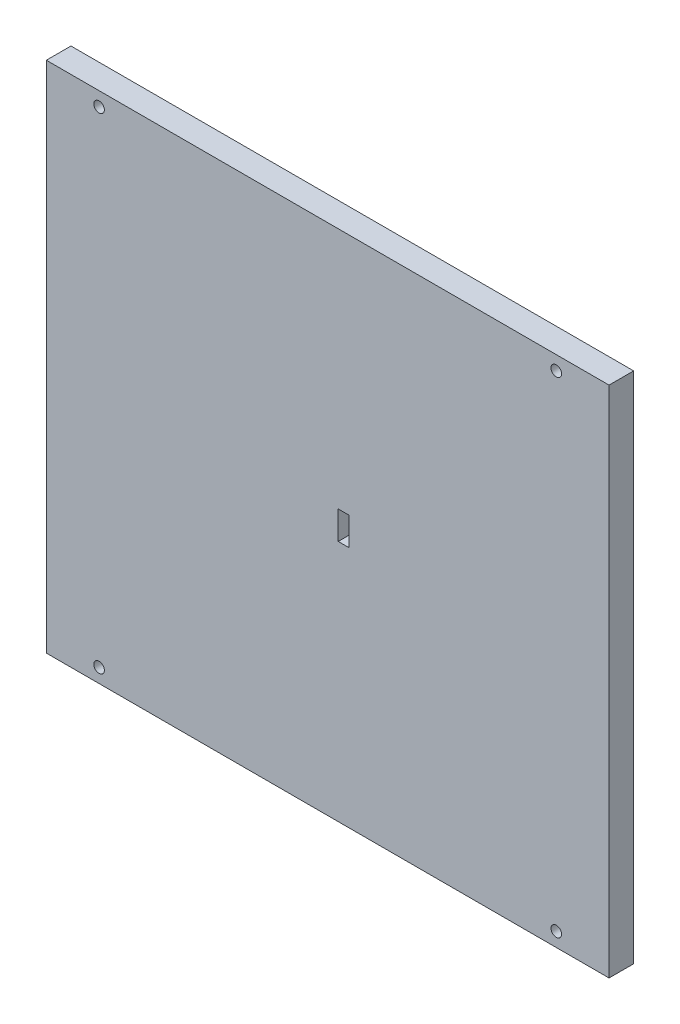
ISO-10303-21;
HEADER;
FILE_DESCRIPTION(('STEP AP214'),'2;1');
FILE_NAME('part.step','',(''),(''),'','','');
FILE_SCHEMA(('AUTOMOTIVE_DESIGN { 1 0 10303 214 1 1 1 1 }'));
ENDSEC;
DATA;
#1=APPLICATION_CONTEXT('core data for automotive mechanical design processes');
#2=APPLICATION_PROTOCOL_DEFINITION('international standard','automotive_design',2000,#1);
#3=PRODUCT_CONTEXT('',#1,'mechanical');
#4=PRODUCT('Part','Part','',(#3));
#5=PRODUCT_RELATED_PRODUCT_CATEGORY('part','',(#4));
#6=PRODUCT_DEFINITION_FORMATION('','',#4);
#7=PRODUCT_DEFINITION_CONTEXT('part definition',#1,'design');
#8=PRODUCT_DEFINITION('design','',#6,#7);
#9=PRODUCT_DEFINITION_SHAPE('','',#8);
#10=(LENGTH_UNIT() NAMED_UNIT(*) SI_UNIT(.MILLI.,.METRE.));
#11=(NAMED_UNIT(*) PLANE_ANGLE_UNIT() SI_UNIT($,.RADIAN.));
#12=(NAMED_UNIT(*) SI_UNIT($,.STERADIAN.) SOLID_ANGLE_UNIT());
#13=UNCERTAINTY_MEASURE_WITH_UNIT(LENGTH_MEASURE(1.E-05),#10,'distance_accuracy_value','');
#14=(GEOMETRIC_REPRESENTATION_CONTEXT(3) GLOBAL_UNCERTAINTY_ASSIGNED_CONTEXT((#13)) GLOBAL_UNIT_ASSIGNED_CONTEXT((#10,
#11,#12)) REPRESENTATION_CONTEXT('',''));
#15=CARTESIAN_POINT('',(0.,0.,0.));
#16=DIRECTION('',(0.,0.,1.));
#17=DIRECTION('',(1.,0.,0.));
#18=AXIS2_PLACEMENT_3D('',#15,#16,#17);
#19=CARTESIAN_POINT('',(0.,0.,0.));
#20=DIRECTION('',(0.,0.,1.));
#21=DIRECTION('',(1.,0.,0.));
#22=AXIS2_PLACEMENT_3D('',#19,#20,#21);
#23=PLANE('',#22);
#24=DIRECTION('',(-1.,0.,0.));
#25=VECTOR('',#24,1.);
#26=CARTESIAN_POINT('',(2.51612513721186,2.01,0.));
#27=LINE('',#26,#25);
#28=CARTESIAN_POINT('',(2.51612513721186,2.01,0.));
#29=VERTEX_POINT('',#28);
#30=CARTESIAN_POINT('',(-0.483874862788143,2.01,0.));
#31=VERTEX_POINT('',#30);
#32=EDGE_CURVE('E152',#29,#31,#27,.T.);
#33=ORIENTED_EDGE('',*,*,#32,.F.);
#34=DIRECTION('',(0.,-1.,0.));
#35=VECTOR('',#34,1.);
#36=CARTESIAN_POINT('',(2.51612513721186,0.0100000000000022,0.));
#37=LINE('',#36,#35);
#38=CARTESIAN_POINT('',(2.51612513721186,0.0100000000000022,0.));
#39=VERTEX_POINT('',#38);
#40=EDGE_CURVE('E162',#29,#39,#37,.T.);
#41=ORIENTED_EDGE('',*,*,#40,.T.);
#42=DIRECTION('',(-1.,0.,0.));
#43=VECTOR('',#42,1.);
#44=CARTESIAN_POINT('',(2.51612513721186,0.0100000000000022,0.));
#45=LINE('',#44,#43);
#46=CARTESIAN_POINT('',(-20.4838748627881,0.0100000000000022,0.));
#47=VERTEX_POINT('',#46);
#48=EDGE_CURVE('E175',#39,#47,#45,.T.);
#49=ORIENTED_EDGE('',*,*,#48,.T.);
#50=DIRECTION('',(0.,1.,0.));
#51=VECTOR('',#50,1.);
#52=CARTESIAN_POINT('',(-20.4838748627881,0.0100000000000022,0.));
#53=LINE('',#52,#51);
#54=CARTESIAN_POINT('',(-20.4838748627881,12.01,0.));
#55=VERTEX_POINT('',#54);
#56=EDGE_CURVE('E177',#47,#55,#53,.T.);
#57=ORIENTED_EDGE('',*,*,#56,.T.);
#58=DIRECTION('',(1.,0.,0.));
#59=VECTOR('',#58,1.);
#60=CARTESIAN_POINT('',(2.51612513721186,12.01,0.));
#61=LINE('',#60,#59);
#62=CARTESIAN_POINT('',(2.51612513721186,12.01,0.));
#63=VERTEX_POINT('',#62);
#64=EDGE_CURVE('E172',#55,#63,#61,.T.);
#65=ORIENTED_EDGE('',*,*,#64,.T.);
#66=CARTESIAN_POINT('',(2.51612513721186,10.01,0.));
#67=VERTEX_POINT('',#66);
#68=EDGE_CURVE('E171',#63,#67,#37,.T.);
#69=ORIENTED_EDGE('',*,*,#68,.T.);
#70=DIRECTION('',(1.,0.,0.));
#71=VECTOR('',#70,1.);
#72=CARTESIAN_POINT('',(2.51612513721186,10.01,0.));
#73=LINE('',#72,#71);
#74=CARTESIAN_POINT('',(-0.483874862788143,10.01,0.));
#75=VERTEX_POINT('',#74);
#76=EDGE_CURVE('E158',#75,#67,#73,.T.);
#77=ORIENTED_EDGE('',*,*,#76,.F.);
#78=DIRECTION('',(0.,1.,0.));
#79=VECTOR('',#78,1.);
#80=CARTESIAN_POINT('',(-0.483874862788143,2.01,0.));
#81=LINE('',#80,#79);
#82=EDGE_CURVE('E53',#31,#75,#81,.T.);
#83=ORIENTED_EDGE('',*,*,#82,.F.);
#84=EDGE_LOOP('',(#33,#41,#49,#57,#65,#69,#77,#83));
#85=FACE_BOUND('',#84,.T.);
#86=ADVANCED_FACE('F38',(#85),#23,.F.);
#87=DIRECTION('',(0.,-1.,0.));
#88=VECTOR('',#87,1.);
#89=CARTESIAN_POINT('',(8.51612513721186,-5.99,0.));
#90=LINE('',#89,#88);
#91=CARTESIAN_POINT('',(8.51612513721186,18.01,0.));
#92=VERTEX_POINT('',#91);
#93=CARTESIAN_POINT('',(8.51612513721186,-5.99,0.));
#94=VERTEX_POINT('',#93);
#95=EDGE_CURVE('E193',#92,#94,#90,.T.);
#96=ORIENTED_EDGE('',*,*,#95,.F.);
#97=DIRECTION('',(1.,0.,0.));
#98=VECTOR('',#97,1.);
#99=CARTESIAN_POINT('',(8.51612513721186,18.01,0.));
#100=LINE('',#99,#98);
#101=CARTESIAN_POINT('',(-26.4838748627881,18.01,0.));
#102=VERTEX_POINT('',#101);
#103=EDGE_CURVE('E198',#102,#92,#100,.T.);
#104=ORIENTED_EDGE('',*,*,#103,.F.);
#105=DIRECTION('',(0.,1.,0.));
#106=VECTOR('',#105,1.);
#107=CARTESIAN_POINT('',(-26.4838748627881,-5.99,0.));
#108=LINE('',#107,#106);
#109=CARTESIAN_POINT('',(-26.4838748627881,-5.99,0.));
#110=VERTEX_POINT('',#109);
#111=EDGE_CURVE('E210',#110,#102,#108,.T.);
#112=ORIENTED_EDGE('',*,*,#111,.F.);
#113=DIRECTION('',(-1.,0.,0.));
#114=VECTOR('',#113,1.);
#115=CARTESIAN_POINT('',(8.51612513721186,-5.99,0.));
#116=LINE('',#115,#114);
#117=EDGE_CURVE('E207',#94,#110,#116,.T.);
#118=ORIENTED_EDGE('',*,*,#117,.F.);
#119=EDGE_LOOP('',(#96,#104,#112,#118));
#120=FACE_BOUND('',#119,.T.);
#121=CARTESIAN_POINT('',(-3.48387486278814,6.01000000000001,0.));
#122=DIRECTION('',(0.,0.,-1.));
#123=DIRECTION('',(-1.,0.,0.));
#124=AXIS2_PLACEMENT_3D('',#121,#122,#123);
#125=CIRCLE('',#124,36.5);
#126=CARTESIAN_POINT('',(33.0161251372119,6.01000000000001,0.));
#127=VERTEX_POINT('',#126);
#128=EDGE_CURVE('E302',#127,#127,#125,.T.);
#129=ORIENTED_EDGE('',*,*,#128,.T.);
#130=EDGE_LOOP('',(#129));
#131=FACE_BOUND('',#130,.T.);
#132=ADVANCED_FACE('F356',(#120,#131),#23,.F.);
#133=CARTESIAN_POINT('',(0.,0.,-13.5));
#134=DIRECTION('',(0.,0.,1.));
#135=DIRECTION('',(1.,0.,0.));
#136=AXIS2_PLACEMENT_3D('',#133,#134,#135);
#137=PLANE('',#136);
#138=CARTESIAN_POINT('',(-22.7338748627881,6.01,-13.5));
#139=DIRECTION('',(0.,0.,-1.));
#140=DIRECTION('',(-1.,0.,0.));
#141=AXIS2_PLACEMENT_3D('',#138,#139,#140);
#142=CIRCLE('',#141,1.);
#143=CARTESIAN_POINT('',(-23.7338748627881,6.01,-13.5));
#144=VERTEX_POINT('',#143);
#145=EDGE_CURVE('E327',#144,#144,#142,.T.);
#146=ORIENTED_EDGE('',*,*,#145,.F.);
#147=EDGE_LOOP('',(#146));
#148=FACE_BOUND('',#147,.T.);
#149=CARTESIAN_POINT('',(4.76612513721186,6.01,-13.5));
#150=DIRECTION('',(0.,0.,-1.));
#151=DIRECTION('',(1.,0.,0.));
#152=AXIS2_PLACEMENT_3D('',#149,#150,#151);
#153=CIRCLE('',#152,1.);
#154=CARTESIAN_POINT('',(5.76612513721186,6.01,-13.5));
#155=VERTEX_POINT('',#154);
#156=EDGE_CURVE('E321',#155,#155,#153,.T.);
#157=ORIENTED_EDGE('',*,*,#156,.F.);
#158=EDGE_LOOP('',(#157));
#159=FACE_BOUND('',#158,.T.);
#160=DIRECTION('',(0.,-1.,0.));
#161=VECTOR('',#160,1.);
#162=CARTESIAN_POINT('',(8.51612513721186,-5.99,-13.5));
#163=LINE('',#162,#161);
#164=CARTESIAN_POINT('',(8.51612513721186,18.01,-13.5));
#165=VERTEX_POINT('',#164);
#166=CARTESIAN_POINT('',(8.51612513721186,-5.99,-13.5));
#167=VERTEX_POINT('',#166);
#168=EDGE_CURVE('E194',#165,#167,#163,.T.);
#169=ORIENTED_EDGE('',*,*,#168,.T.);
#170=DIRECTION('',(-1.,0.,0.));
#171=VECTOR('',#170,1.);
#172=CARTESIAN_POINT('',(8.51612513721186,-5.99,-13.5));
#173=LINE('',#172,#171);
#174=CARTESIAN_POINT('',(-26.4838748627881,-5.99,-13.5));
#175=VERTEX_POINT('',#174);
#176=EDGE_CURVE('E197',#167,#175,#173,.T.);
#177=ORIENTED_EDGE('',*,*,#176,.T.);
#178=DIRECTION('',(0.,1.,0.));
#179=VECTOR('',#178,1.);
#180=CARTESIAN_POINT('',(-26.4838748627881,-5.99,-13.5));
#181=LINE('',#180,#179);
#182=CARTESIAN_POINT('',(-26.4838748627881,18.01,-13.5));
#183=VERTEX_POINT('',#182);
#184=EDGE_CURVE('E200',#175,#183,#181,.T.);
#185=ORIENTED_EDGE('',*,*,#184,.T.);
#186=DIRECTION('',(1.,0.,0.));
#187=VECTOR('',#186,1.);
#188=CARTESIAN_POINT('',(8.51612513721186,18.01,-13.5));
#189=LINE('',#188,#187);
#190=EDGE_CURVE('E202',#183,#165,#189,.T.);
#191=ORIENTED_EDGE('',*,*,#190,.T.);
#192=EDGE_LOOP('',(#169,#177,#185,#191));
#193=FACE_BOUND('',#192,.T.);
#194=DIRECTION('',(0.,1.,0.));
#195=VECTOR('',#194,1.);
#196=CARTESIAN_POINT('',(-20.4838748627881,0.0100000000000022,-13.5));
#197=LINE('',#196,#195);
#198=CARTESIAN_POINT('',(-20.4838748627881,0.0100000000000022,-13.5));
#199=VERTEX_POINT('',#198);
#200=CARTESIAN_POINT('',(-20.4838748627881,12.01,-13.5));
#201=VERTEX_POINT('',#200);
#202=EDGE_CURVE('E182',#199,#201,#197,.T.);
#203=ORIENTED_EDGE('',*,*,#202,.F.);
#204=DIRECTION('',(-1.,0.,0.));
#205=VECTOR('',#204,1.);
#206=CARTESIAN_POINT('',(2.51612513721186,0.0100000000000022,-13.5));
#207=LINE('',#206,#205);
#208=CARTESIAN_POINT('',(2.51612513721186,0.0100000000000022,-13.5));
#209=VERTEX_POINT('',#208);
#210=EDGE_CURVE('E186',#209,#199,#207,.T.);
#211=ORIENTED_EDGE('',*,*,#210,.F.);
#212=DIRECTION('',(0.,-1.,0.));
#213=VECTOR('',#212,1.);
#214=CARTESIAN_POINT('',(2.51612513721186,0.0100000000000022,-13.5));
#215=LINE('',#214,#213);
#216=CARTESIAN_POINT('',(2.51612513721186,12.01,-13.5));
#217=VERTEX_POINT('',#216);
#218=EDGE_CURVE('E318',#217,#209,#215,.T.);
#219=ORIENTED_EDGE('',*,*,#218,.F.);
#220=DIRECTION('',(1.,0.,0.));
#221=VECTOR('',#220,1.);
#222=CARTESIAN_POINT('',(2.51612513721186,12.01,-13.5));
#223=LINE('',#222,#221);
#224=EDGE_CURVE('E316',#201,#217,#223,.T.);
#225=ORIENTED_EDGE('',*,*,#224,.F.);
#226=EDGE_LOOP('',(#203,#211,#219,#225));
#227=FACE_BOUND('',#226,.T.);
#228=ADVANCED_FACE('F379',(#148,#159,#193,#227),#137,.F.);
#229=CARTESIAN_POINT('',(8.51612513721186,-5.99,-13.5));
#230=DIRECTION('',(-1.,0.,0.));
#231=DIRECTION('',(0.,0.,1.));
#232=AXIS2_PLACEMENT_3D('',#229,#230,#231);
#233=PLANE('',#232);
#234=ORIENTED_EDGE('',*,*,#95,.T.);
#235=DIRECTION('',(0.,0.,1.));
#236=VECTOR('',#235,1.);
#237=CARTESIAN_POINT('',(8.51612513721186,-5.99,-13.5));
#238=LINE('',#237,#236);
#239=EDGE_CURVE('E223',#167,#94,#238,.T.);
#240=ORIENTED_EDGE('',*,*,#239,.F.);
#241=ORIENTED_EDGE('',*,*,#168,.F.);
#242=DIRECTION('',(0.,0.,1.));
#243=VECTOR('',#242,1.);
#244=CARTESIAN_POINT('',(8.51612513721186,18.01,-13.5));
#245=LINE('',#244,#243);
#246=EDGE_CURVE('E204',#165,#92,#245,.T.);
#247=ORIENTED_EDGE('',*,*,#246,.T.);
#248=EDGE_LOOP('',(#234,#240,#241,#247));
#249=FACE_BOUND('',#248,.T.);
#250=ADVANCED_FACE('F416',(#249),#233,.F.);
#251=CARTESIAN_POINT('',(8.51612513721186,-5.99,-13.5));
#252=DIRECTION('',(0.,1.,0.));
#253=DIRECTION('',(0.,0.,1.));
#254=AXIS2_PLACEMENT_3D('',#251,#252,#253);
#255=PLANE('',#254);
#256=ORIENTED_EDGE('',*,*,#117,.T.);
#257=DIRECTION('',(0.,0.,1.));
#258=VECTOR('',#257,1.);
#259=CARTESIAN_POINT('',(-26.4838748627881,-5.99,-13.5));
#260=LINE('',#259,#258);
#261=EDGE_CURVE('E220',#175,#110,#260,.T.);
#262=ORIENTED_EDGE('',*,*,#261,.F.);
#263=ORIENTED_EDGE('',*,*,#176,.F.);
#264=ORIENTED_EDGE('',*,*,#239,.T.);
#265=EDGE_LOOP('',(#256,#262,#263,#264));
#266=FACE_BOUND('',#265,.T.);
#267=ADVANCED_FACE('F622',(#266),#255,.F.);
#268=CARTESIAN_POINT('',(-26.4838748627881,-5.99,-13.5));
#269=DIRECTION('',(1.,0.,0.));
#270=DIRECTION('',(0.,0.,-1.));
#271=AXIS2_PLACEMENT_3D('',#268,#269,#270);
#272=PLANE('',#271);
#273=ORIENTED_EDGE('',*,*,#111,.T.);
#274=DIRECTION('',(0.,0.,1.));
#275=VECTOR('',#274,1.);
#276=CARTESIAN_POINT('',(-26.4838748627881,18.01,-13.5));
#277=LINE('',#276,#275);
#278=EDGE_CURVE('E217',#183,#102,#277,.T.);
#279=ORIENTED_EDGE('',*,*,#278,.F.);
#280=ORIENTED_EDGE('',*,*,#184,.F.);
#281=ORIENTED_EDGE('',*,*,#261,.T.);
#282=EDGE_LOOP('',(#273,#279,#280,#281));
#283=FACE_BOUND('',#282,.T.);
#284=ADVANCED_FACE('F614',(#283),#272,.F.);
#285=CARTESIAN_POINT('',(8.51612513721186,18.01,-13.5));
#286=DIRECTION('',(0.,-1.,0.));
#287=DIRECTION('',(0.,0.,-1.));
#288=AXIS2_PLACEMENT_3D('',#285,#286,#287);
#289=PLANE('',#288);
#290=ORIENTED_EDGE('',*,*,#103,.T.);
#291=ORIENTED_EDGE('',*,*,#246,.F.);
#292=ORIENTED_EDGE('',*,*,#190,.F.);
#293=ORIENTED_EDGE('',*,*,#278,.T.);
#294=EDGE_LOOP('',(#290,#291,#292,#293));
#295=FACE_BOUND('',#294,.T.);
#296=ADVANCED_FACE('F608',(#295),#289,.F.);
#297=CARTESIAN_POINT('',(-20.4838748627881,0.0100000000000022,-13.5));
#298=DIRECTION('',(1.,0.,0.));
#299=DIRECTION('',(0.,0.,-1.));
#300=AXIS2_PLACEMENT_3D('',#297,#298,#299);
#301=PLANE('',#300);
#302=ORIENTED_EDGE('',*,*,#56,.F.);
#303=DIRECTION('',(0.,0.,1.));
#304=VECTOR('',#303,1.);
#305=CARTESIAN_POINT('',(-20.4838748627881,0.0100000000000022,-13.5));
#306=LINE('',#305,#304);
#307=EDGE_CURVE('E183',#199,#47,#306,.T.);
#308=ORIENTED_EDGE('',*,*,#307,.F.);
#309=ORIENTED_EDGE('',*,*,#202,.T.);
#310=DIRECTION('',(0.,0.,1.));
#311=VECTOR('',#310,1.);
#312=CARTESIAN_POINT('',(-20.4838748627881,12.01,-13.5));
#313=LINE('',#312,#311);
#314=EDGE_CURVE('E190',#201,#55,#313,.T.);
#315=ORIENTED_EDGE('',*,*,#314,.T.);
#316=EDGE_LOOP('',(#302,#308,#309,#315));
#317=FACE_BOUND('',#316,.T.);
#318=ADVANCED_FACE('F311',(#317),#301,.T.);
#319=CARTESIAN_POINT('',(2.51612513721186,12.01,-13.5));
#320=DIRECTION('',(0.,-1.,0.));
#321=DIRECTION('',(0.,0.,-1.));
#322=AXIS2_PLACEMENT_3D('',#319,#320,#321);
#323=PLANE('',#322);
#324=ORIENTED_EDGE('',*,*,#64,.F.);
#325=ORIENTED_EDGE('',*,*,#314,.F.);
#326=ORIENTED_EDGE('',*,*,#224,.T.);
#327=DIRECTION('',(0.,0.,1.));
#328=VECTOR('',#327,1.);
#329=CARTESIAN_POINT('',(2.51612513721186,12.01,-13.5));
#330=LINE('',#329,#328);
#331=EDGE_CURVE('E188',#217,#63,#330,.T.);
#332=ORIENTED_EDGE('',*,*,#331,.T.);
#333=EDGE_LOOP('',(#324,#325,#326,#332));
#334=FACE_BOUND('',#333,.T.);
#335=ADVANCED_FACE('F308',(#334),#323,.T.);
#336=CARTESIAN_POINT('',(2.51612513721186,0.0100000000000022,-13.5));
#337=DIRECTION('',(-1.,0.,0.));
#338=DIRECTION('',(0.,0.,1.));
#339=AXIS2_PLACEMENT_3D('',#336,#337,#338);
#340=PLANE('',#339);
#341=ORIENTED_EDGE('',*,*,#68,.F.);
#342=ORIENTED_EDGE('',*,*,#331,.F.);
#343=ORIENTED_EDGE('',*,*,#218,.T.);
#344=DIRECTION('',(0.,0.,1.));
#345=VECTOR('',#344,1.);
#346=CARTESIAN_POINT('',(2.51612513721186,0.0100000000000022,-13.5));
#347=LINE('',#346,#345);
#348=EDGE_CURVE('E170',#209,#39,#347,.T.);
#349=ORIENTED_EDGE('',*,*,#348,.T.);
#350=ORIENTED_EDGE('',*,*,#40,.F.);
#351=DIRECTION('',(0.,0.,-1.));
#352=VECTOR('',#351,1.);
#353=CARTESIAN_POINT('',(2.51612513721186,2.01,41.));
#354=LINE('',#353,#352);
#355=CARTESIAN_POINT('',(2.51612513721186,2.01,7.));
#356=VERTEX_POINT('',#355);
#357=EDGE_CURVE('E149',#356,#29,#354,.T.);
#358=ORIENTED_EDGE('',*,*,#357,.F.);
#359=DIRECTION('',(0.,1.,0.));
#360=VECTOR('',#359,1.);
#361=CARTESIAN_POINT('',(2.51612513721186,0.,7.));
#362=LINE('',#361,#360);
#363=CARTESIAN_POINT('',(2.51612513721186,10.01,7.));
#364=VERTEX_POINT('',#363);
#365=EDGE_CURVE('E11',#356,#364,#362,.T.);
#366=ORIENTED_EDGE('',*,*,#365,.T.);
#367=DIRECTION('',(0.,0.,-1.));
#368=VECTOR('',#367,1.);
#369=CARTESIAN_POINT('',(2.51612513721186,10.01,41.));
#370=LINE('',#369,#368);
#371=EDGE_CURVE('E294',#364,#67,#370,.T.);
#372=ORIENTED_EDGE('',*,*,#371,.T.);
#373=EDGE_LOOP('',(#341,#342,#343,#349,#350,#358,#366,#372));
#374=FACE_BOUND('',#373,.T.);
#375=ADVANCED_FACE('F168',(#374),#340,.T.);
#376=CARTESIAN_POINT('',(2.51612513721186,0.0100000000000022,-13.5));
#377=DIRECTION('',(0.,1.,0.));
#378=DIRECTION('',(0.,0.,1.));
#379=AXIS2_PLACEMENT_3D('',#376,#377,#378);
#380=PLANE('',#379);
#381=ORIENTED_EDGE('',*,*,#48,.F.);
#382=ORIENTED_EDGE('',*,*,#348,.F.);
#383=ORIENTED_EDGE('',*,*,#210,.T.);
#384=ORIENTED_EDGE('',*,*,#307,.T.);
#385=EDGE_LOOP('',(#381,#382,#383,#384));
#386=FACE_BOUND('',#385,.T.);
#387=ADVANCED_FACE('F522',(#386),#380,.T.);
#388=CARTESIAN_POINT('',(4.76612513721186,6.01,-8.5));
#389=DIRECTION('',(0.,0.,-1.));
#390=DIRECTION('',(-1.,0.,0.));
#391=AXIS2_PLACEMENT_3D('',#388,#389,#390);
#392=CYLINDRICAL_SURFACE('',#391,1.);
#393=CARTESIAN_POINT('',(4.76612513721186,6.01,-8.5));
#394=DIRECTION('',(0.,0.,-1.));
#395=DIRECTION('',(1.,0.,0.));
#396=AXIS2_PLACEMENT_3D('',#393,#394,#395);
#397=CIRCLE('',#396,1.);
#398=CARTESIAN_POINT('',(5.76612513721186,6.01,-8.5));
#399=VERTEX_POINT('',#398);
#400=EDGE_CURVE('E332',#399,#399,#397,.T.);
#401=ORIENTED_EDGE('',*,*,#400,.F.);
#402=EDGE_LOOP('',(#401));
#403=FACE_BOUND('',#402,.T.);
#404=ORIENTED_EDGE('',*,*,#156,.T.);
#405=EDGE_LOOP('',(#404));
#406=FACE_BOUND('',#405,.T.);
#407=ADVANCED_FACE('F537',(#403,#406),#392,.F.);
#408=CARTESIAN_POINT('',(4.76612513721186,6.01,-8.5));
#409=DIRECTION('',(0.,0.,1.));
#410=DIRECTION('',(1.,0.,0.));
#411=AXIS2_PLACEMENT_3D('',#408,#409,#410);
#412=PLANE('',#411);
#413=ORIENTED_EDGE('',*,*,#400,.T.);
#414=EDGE_LOOP('',(#413));
#415=FACE_BOUND('',#414,.T.);
#416=ADVANCED_FACE('F547',(#415),#412,.F.);
#417=CARTESIAN_POINT('',(-22.7338748627881,6.01,-8.5));
#418=DIRECTION('',(0.,0.,-1.));
#419=DIRECTION('',(-1.,0.,0.));
#420=AXIS2_PLACEMENT_3D('',#417,#418,#419);
#421=CYLINDRICAL_SURFACE('',#420,1.);
#422=CARTESIAN_POINT('',(-22.7338748627881,6.01,-8.5));
#423=DIRECTION('',(0.,0.,-1.));
#424=DIRECTION('',(-1.,0.,0.));
#425=AXIS2_PLACEMENT_3D('',#422,#423,#424);
#426=CIRCLE('',#425,1.);
#427=CARTESIAN_POINT('',(-23.7338748627881,6.01,-8.5));
#428=VERTEX_POINT('',#427);
#429=EDGE_CURVE('E325',#428,#428,#426,.T.);
#430=ORIENTED_EDGE('',*,*,#429,.F.);
#431=EDGE_LOOP('',(#430));
#432=FACE_BOUND('',#431,.T.);
#433=ORIENTED_EDGE('',*,*,#145,.T.);
#434=EDGE_LOOP('',(#433));
#435=FACE_BOUND('',#434,.T.);
#436=ADVANCED_FACE('F556',(#432,#435),#421,.F.);
#437=CARTESIAN_POINT('',(-22.7338748627881,6.01,-8.5));
#438=DIRECTION('',(0.,0.,-1.));
#439=DIRECTION('',(-1.,0.,0.));
#440=AXIS2_PLACEMENT_3D('',#437,#438,#439);
#441=PLANE('',#440);
#442=ORIENTED_EDGE('',*,*,#429,.T.);
#443=EDGE_LOOP('',(#442));
#444=FACE_BOUND('',#443,.T.);
#445=ADVANCED_FACE('F564',(#444),#441,.T.);
#446=CARTESIAN_POINT('',(-3.48387486278814,6.01000000000001,-28.5));
#447=DIRECTION('',(0.,0.,-1.));
#448=DIRECTION('',(-1.,0.,0.));
#449=AXIS2_PLACEMENT_3D('',#446,#447,#448);
#450=PLANE('',#449);
#451=CARTESIAN_POINT('',(-3.48387486278814,6.01000000000001,-28.5));
#452=DIRECTION('',(0.,0.,-1.));
#453=DIRECTION('',(-1.,0.,0.));
#454=AXIS2_PLACEMENT_3D('',#451,#452,#453);
#455=CIRCLE('',#454,40.);
#456=CARTESIAN_POINT('',(36.5161251372119,6.01000000000001,-28.5));
#457=VERTEX_POINT('',#456);
#458=EDGE_CURVE('E335',#457,#457,#455,.T.);
#459=ORIENTED_EDGE('',*,*,#458,.T.);
#460=EDGE_LOOP('',(#459));
#461=FACE_BOUND('',#460,.T.);
#462=CARTESIAN_POINT('',(-3.48387486278814,6.01000000000001,-28.5));
#463=DIRECTION('',(0.,0.,-1.));
#464=DIRECTION('',(-1.,0.,0.));
#465=AXIS2_PLACEMENT_3D('',#462,#463,#464);
#466=CIRCLE('',#465,36.5);
#467=CARTESIAN_POINT('',(33.0161251372119,6.01000000000001,-28.5));
#468=VERTEX_POINT('',#467);
#469=EDGE_CURVE('E344',#468,#468,#466,.T.);
#470=ORIENTED_EDGE('',*,*,#469,.F.);
#471=EDGE_LOOP('',(#470));
#472=FACE_BOUND('',#471,.T.);
#473=ADVANCED_FACE('F368',(#461,#472),#450,.T.);
#474=CARTESIAN_POINT('',(-3.48387486278814,6.01000000000001,-28.5));
#475=DIRECTION('',(0.,0.,1.));
#476=DIRECTION('',(1.,0.,0.));
#477=AXIS2_PLACEMENT_3D('',#474,#475,#476);
#478=CYLINDRICAL_SURFACE('',#477,40.);
#479=CARTESIAN_POINT('',(-3.48387486278814,6.01000000000001,-10.));
#480=DIRECTION('',(0.,0.,1.));
#481=DIRECTION('',(1.,0.,0.));
#482=AXIS2_PLACEMENT_3D('',#479,#480,#481);
#483=CIRCLE('',#482,40.);
#484=CARTESIAN_POINT('',(36.5161251372119,6.01000000000001,-10.));
#485=VERTEX_POINT('',#484);
#486=EDGE_CURVE('E280',#485,#485,#483,.F.);
#487=CARTESIAN_POINT('',(36.5161251372119,6.01000000000001,-10.));
#488=CARTESIAN_POINT('',(36.5161251372119,6.01000000000001,-10.1927083333333));
#489=CARTESIAN_POINT('',(36.5161251372119,6.01000000000001,-10.3854166666667));
#490=CARTESIAN_POINT('',(36.5161251372119,6.01000000000001,-10.7708333333333));
#491=CARTESIAN_POINT('',(36.5161251372119,6.01000000000001,-10.9635416666667));
#492=CARTESIAN_POINT('',(36.5161251372119,6.01000000000001,-11.3489583333333));
#493=CARTESIAN_POINT('',(36.5161251372119,6.01000000000001,-11.5416666666667));
#494=CARTESIAN_POINT('',(36.5161251372119,6.01000000000001,-11.9270833333333));
#495=CARTESIAN_POINT('',(36.5161251372119,6.01000000000001,-12.1197916666667));
#496=CARTESIAN_POINT('',(36.5161251372119,6.01000000000001,-12.5052083333333));
#497=CARTESIAN_POINT('',(36.5161251372119,6.01000000000001,-12.6979166666667));
#498=CARTESIAN_POINT('',(36.5161251372119,6.01000000000001,-13.0833333333333));
#499=CARTESIAN_POINT('',(36.5161251372119,6.01000000000001,-13.2760416666667));
#500=CARTESIAN_POINT('',(36.5161251372119,6.01000000000001,-13.6614583333333));
#501=CARTESIAN_POINT('',(36.5161251372119,6.01000000000001,-13.8541666666667));
#502=CARTESIAN_POINT('',(36.5161251372119,6.01000000000001,-14.2395833333333));
#503=CARTESIAN_POINT('',(36.5161251372119,6.01000000000001,-14.4322916666667));
#504=CARTESIAN_POINT('',(36.5161251372119,6.01000000000001,-14.8177083333333));
#505=CARTESIAN_POINT('',(36.5161251372119,6.01000000000001,-15.0104166666667));
#506=CARTESIAN_POINT('',(36.5161251372119,6.01000000000001,-15.3958333333333));
#507=CARTESIAN_POINT('',(36.5161251372119,6.01000000000001,-15.5885416666667));
#508=CARTESIAN_POINT('',(36.5161251372119,6.01000000000001,-15.9739583333333));
#509=CARTESIAN_POINT('',(36.5161251372119,6.01000000000001,-16.1666666666667));
#510=CARTESIAN_POINT('',(36.5161251372119,6.01000000000001,-16.5520833333333));
#511=CARTESIAN_POINT('',(36.5161251372119,6.01000000000001,-16.7447916666667));
#512=CARTESIAN_POINT('',(36.5161251372119,6.01000000000001,-17.1302083333333));
#513=CARTESIAN_POINT('',(36.5161251372119,6.01000000000001,-17.3229166666667));
#514=CARTESIAN_POINT('',(36.5161251372119,6.01000000000001,-17.7083333333333));
#515=CARTESIAN_POINT('',(36.5161251372119,6.01000000000001,-17.9010416666667));
#516=CARTESIAN_POINT('',(36.5161251372119,6.01000000000001,-18.2864583333333));
#517=CARTESIAN_POINT('',(36.5161251372119,6.01000000000001,-18.4791666666667));
#518=CARTESIAN_POINT('',(36.5161251372119,6.01000000000001,-18.8645833333333));
#519=CARTESIAN_POINT('',(36.5161251372119,6.01000000000001,-19.0572916666667));
#520=CARTESIAN_POINT('',(36.5161251372119,6.01000000000001,-19.4427083333333));
#521=CARTESIAN_POINT('',(36.5161251372119,6.01000000000001,-19.6354166666667));
#522=CARTESIAN_POINT('',(36.5161251372119,6.01000000000001,-20.0208333333333));
#523=CARTESIAN_POINT('',(36.5161251372119,6.01000000000001,-20.2135416666667));
#524=CARTESIAN_POINT('',(36.5161251372119,6.01000000000001,-20.5989583333333));
#525=CARTESIAN_POINT('',(36.5161251372119,6.01000000000001,-20.7916666666667));
#526=CARTESIAN_POINT('',(36.5161251372119,6.01000000000001,-21.1770833333333));
#527=CARTESIAN_POINT('',(36.5161251372119,6.01000000000001,-21.3697916666667));
#528=CARTESIAN_POINT('',(36.5161251372119,6.01000000000001,-21.7552083333333));
#529=CARTESIAN_POINT('',(36.5161251372119,6.01000000000001,-21.9479166666667));
#530=CARTESIAN_POINT('',(36.5161251372119,6.01000000000001,-22.3333333333333));
#531=CARTESIAN_POINT('',(36.5161251372119,6.01000000000001,-22.5260416666667));
#532=CARTESIAN_POINT('',(36.5161251372119,6.01000000000001,-22.9114583333333));
#533=CARTESIAN_POINT('',(36.5161251372119,6.01000000000001,-23.1041666666667));
#534=CARTESIAN_POINT('',(36.5161251372119,6.01000000000001,-23.4895833333333));
#535=CARTESIAN_POINT('',(36.5161251372119,6.01000000000001,-23.6822916666667));
#536=CARTESIAN_POINT('',(36.5161251372119,6.01000000000001,-24.0677083333333));
#537=CARTESIAN_POINT('',(36.5161251372119,6.01000000000001,-24.2604166666667));
#538=CARTESIAN_POINT('',(36.5161251372119,6.01000000000001,-24.6458333333333));
#539=CARTESIAN_POINT('',(36.5161251372119,6.01000000000001,-24.8385416666667));
#540=CARTESIAN_POINT('',(36.5161251372119,6.01000000000001,-25.2239583333333));
#541=CARTESIAN_POINT('',(36.5161251372119,6.01000000000001,-25.4166666666667));
#542=CARTESIAN_POINT('',(36.5161251372119,6.01000000000001,-25.8020833333333));
#543=CARTESIAN_POINT('',(36.5161251372119,6.01000000000001,-25.9947916666667));
#544=CARTESIAN_POINT('',(36.5161251372119,6.01000000000001,-26.3802083333333));
#545=CARTESIAN_POINT('',(36.5161251372119,6.01000000000001,-26.5729166666667));
#546=CARTESIAN_POINT('',(36.5161251372119,6.01000000000001,-26.9583333333333));
#547=CARTESIAN_POINT('',(36.5161251372119,6.01000000000001,-27.1510416666667));
#548=CARTESIAN_POINT('',(36.5161251372119,6.01000000000001,-27.5364583333333));
#549=CARTESIAN_POINT('',(36.5161251372119,6.01000000000001,-27.7291666666667));
#550=CARTESIAN_POINT('',(36.5161251372119,6.01000000000001,-28.1145833333333));
#551=CARTESIAN_POINT('',(36.5161251372119,6.01000000000001,-28.3072916666667));
#552=CARTESIAN_POINT('',(36.5161251372119,6.01000000000001,-28.5));
#553=B_SPLINE_CURVE_WITH_KNOTS('',3,(#487,#488,#489,#490,#491,#492,#493,#494,#495,#496,#497,
#498,#499,#500,#501,#502,#503,#504,#505,#506,#507,#508,#509,#510,#511,#512,#513,#514,#515,#516,
#517,#518,#519,#520,#521,#522,#523,#524,#525,#526,#527,#528,#529,#530,#531,#532,#533,#534,#535,
#536,#537,#538,#539,#540,#541,#542,#543,#544,#545,#546,#547,#548,#549,#550,#551,#552),
.UNSPECIFIED.,.F.,.F.,(4,2,2,2,2,2,2,2,2,2,2,2,2,2,2,2,2,2,2,2,2,2,2,2,2,2,2,2,2,2,2,2,4),(0.,
0.578124999999999,1.15625,1.734375,2.3125,2.890625,3.46875,4.046875,4.625,5.203125,5.78125,
6.359375,6.9375,7.515625,8.09375,8.671875,9.25,9.828125,10.40625,10.984375,11.5625,12.140625,
12.71875,13.296875,13.875,14.453125,15.03125,15.609375,16.1875,16.765625,17.34375,17.921875,
18.5),.UNSPECIFIED.);
#554=EDGE_CURVE('BSEAM360',#485,#457,#553,.T.);
#555=ORIENTED_EDGE('',*,*,#486,.T.);
#556=ORIENTED_EDGE('',*,*,#458,.F.);
#557=ORIENTED_EDGE('',*,*,#554,.T.);
#558=ORIENTED_EDGE('',*,*,#554,.F.);
#559=EDGE_LOOP('',(#555,#557,#556,#558));
#560=FACE_BOUND('',#559,.T.);
#561=ADVANCED_FACE('F360',(#560),#478,.T.);
#562=CARTESIAN_POINT('',(-3.48387486278814,6.01000000000001,-28.5));
#563=DIRECTION('',(0.,0.,1.));
#564=DIRECTION('',(1.,0.,0.));
#565=AXIS2_PLACEMENT_3D('',#562,#563,#564);
#566=CYLINDRICAL_SURFACE('',#565,36.5);
#567=CARTESIAN_POINT('',(33.0161251372119,6.01000000000001,-28.5));
#568=CARTESIAN_POINT('',(33.0161251372119,6.01000000000001,-28.203125));
#569=CARTESIAN_POINT('',(33.0161251372119,6.01000000000001,-27.90625));
#570=CARTESIAN_POINT('',(33.0161251372119,6.01000000000001,-27.3125));
#571=CARTESIAN_POINT('',(33.0161251372119,6.01000000000001,-27.015625));
#572=CARTESIAN_POINT('',(33.0161251372119,6.01000000000001,-26.421875));
#573=CARTESIAN_POINT('',(33.0161251372119,6.01000000000001,-26.125));
#574=CARTESIAN_POINT('',(33.0161251372119,6.01000000000001,-25.53125));
#575=CARTESIAN_POINT('',(33.0161251372119,6.01000000000001,-25.234375));
#576=CARTESIAN_POINT('',(33.0161251372119,6.01000000000001,-24.640625));
#577=CARTESIAN_POINT('',(33.0161251372119,6.01000000000001,-24.34375));
#578=CARTESIAN_POINT('',(33.0161251372119,6.01000000000001,-23.75));
#579=CARTESIAN_POINT('',(33.0161251372119,6.01000000000001,-23.453125));
#580=CARTESIAN_POINT('',(33.0161251372119,6.01000000000001,-22.859375));
#581=CARTESIAN_POINT('',(33.0161251372119,6.01000000000001,-22.5625));
#582=CARTESIAN_POINT('',(33.0161251372119,6.01000000000001,-21.96875));
#583=CARTESIAN_POINT('',(33.0161251372119,6.01000000000001,-21.671875));
#584=CARTESIAN_POINT('',(33.0161251372119,6.01000000000001,-21.078125));
#585=CARTESIAN_POINT('',(33.0161251372119,6.01000000000001,-20.78125));
#586=CARTESIAN_POINT('',(33.0161251372119,6.01000000000001,-20.1875));
#587=CARTESIAN_POINT('',(33.0161251372119,6.01000000000001,-19.890625));
#588=CARTESIAN_POINT('',(33.0161251372119,6.01000000000001,-19.296875));
#589=CARTESIAN_POINT('',(33.0161251372119,6.01000000000001,-19.));
#590=CARTESIAN_POINT('',(33.0161251372119,6.01000000000001,-18.40625));
#591=CARTESIAN_POINT('',(33.0161251372119,6.01000000000001,-18.109375));
#592=CARTESIAN_POINT('',(33.0161251372119,6.01000000000001,-17.515625));
#593=CARTESIAN_POINT('',(33.0161251372119,6.01000000000001,-17.21875));
#594=CARTESIAN_POINT('',(33.0161251372119,6.01000000000001,-16.625));
#595=CARTESIAN_POINT('',(33.0161251372119,6.01000000000001,-16.328125));
#596=CARTESIAN_POINT('',(33.0161251372119,6.01000000000001,-15.734375));
#597=CARTESIAN_POINT('',(33.0161251372119,6.01000000000001,-15.4375));
#598=CARTESIAN_POINT('',(33.0161251372119,6.01000000000001,-14.84375));
#599=CARTESIAN_POINT('',(33.0161251372119,6.01000000000001,-14.546875));
#600=CARTESIAN_POINT('',(33.0161251372119,6.01000000000001,-13.953125));
#601=CARTESIAN_POINT('',(33.0161251372119,6.01000000000001,-13.65625));
#602=CARTESIAN_POINT('',(33.0161251372119,6.01000000000001,-13.0625));
#603=CARTESIAN_POINT('',(33.0161251372119,6.01000000000001,-12.765625));
#604=CARTESIAN_POINT('',(33.0161251372119,6.01000000000001,-12.171875));
#605=CARTESIAN_POINT('',(33.0161251372119,6.01000000000001,-11.875));
#606=CARTESIAN_POINT('',(33.0161251372119,6.01000000000001,-11.28125));
#607=CARTESIAN_POINT('',(33.0161251372119,6.01000000000001,-10.984375));
#608=CARTESIAN_POINT('',(33.0161251372119,6.01000000000001,-10.390625));
#609=CARTESIAN_POINT('',(33.0161251372119,6.01000000000001,-10.09375));
#610=CARTESIAN_POINT('',(33.0161251372119,6.01000000000001,-9.5));
#611=CARTESIAN_POINT('',(33.0161251372119,6.01000000000001,-9.203125));
#612=CARTESIAN_POINT('',(33.0161251372119,6.01000000000001,-8.609375));
#613=CARTESIAN_POINT('',(33.0161251372119,6.01000000000001,-8.3125));
#614=CARTESIAN_POINT('',(33.0161251372119,6.01000000000001,-7.71875));
#615=CARTESIAN_POINT('',(33.0161251372119,6.01000000000001,-7.421875));
#616=CARTESIAN_POINT('',(33.0161251372119,6.01000000000001,-6.828125));
#617=CARTESIAN_POINT('',(33.0161251372119,6.01000000000001,-6.53125));
#618=CARTESIAN_POINT('',(33.0161251372119,6.01000000000001,-5.9375));
#619=CARTESIAN_POINT('',(33.0161251372119,6.01000000000001,-5.640625));
#620=CARTESIAN_POINT('',(33.0161251372119,6.01000000000001,-5.046875));
#621=CARTESIAN_POINT('',(33.0161251372119,6.01000000000001,-4.75));
#622=CARTESIAN_POINT('',(33.0161251372119,6.01000000000001,-4.15625));
#623=CARTESIAN_POINT('',(33.0161251372119,6.01000000000001,-3.859375));
#624=CARTESIAN_POINT('',(33.0161251372119,6.01000000000001,-3.265625));
#625=CARTESIAN_POINT('',(33.0161251372119,6.01000000000001,-2.96875));
#626=CARTESIAN_POINT('',(33.0161251372119,6.01000000000001,-2.375));
#627=CARTESIAN_POINT('',(33.0161251372119,6.01000000000001,-2.078125));
#628=CARTESIAN_POINT('',(33.0161251372119,6.01000000000001,-1.484375));
#629=CARTESIAN_POINT('',(33.0161251372119,6.01000000000001,-1.1875));
#630=CARTESIAN_POINT('',(33.0161251372119,6.01000000000001,-0.593749999999999));
#631=CARTESIAN_POINT('',(33.0161251372119,6.01000000000001,-0.296875));
#632=CARTESIAN_POINT('',(33.0161251372119,6.01000000000001,0.));
#633=B_SPLINE_CURVE_WITH_KNOTS('',3,(#567,#568,#569,#570,#571,#572,#573,#574,#575,#576,#577,
#578,#579,#580,#581,#582,#583,#584,#585,#586,#587,#588,#589,#590,#591,#592,#593,#594,#595,#596,
#597,#598,#599,#600,#601,#602,#603,#604,#605,#606,#607,#608,#609,#610,#611,#612,#613,#614,#615,
#616,#617,#618,#619,#620,#621,#622,#623,#624,#625,#626,#627,#628,#629,#630,#631,#632),
.UNSPECIFIED.,.F.,.F.,(4,2,2,2,2,2,2,2,2,2,2,2,2,2,2,2,2,2,2,2,2,2,2,2,2,2,2,2,2,2,2,2,4),(0.,
0.890625000000003,1.78125,2.671875,3.5625,4.453125,5.34375,6.234375,7.125,8.015625,8.90625,
9.796875,10.6875,11.578125,12.46875,13.359375,14.25,15.140625,16.03125,16.921875,17.8125,
18.703125,19.59375,20.484375,21.375,22.265625,23.15625,24.046875,24.9375,25.828125,26.71875,
27.609375,28.5),.UNSPECIFIED.);
#634=EDGE_CURVE('BSEAM358',#468,#127,#633,.T.);
#635=ORIENTED_EDGE('',*,*,#469,.T.);
#636=ORIENTED_EDGE('',*,*,#128,.F.);
#637=ORIENTED_EDGE('',*,*,#634,.T.);
#638=ORIENTED_EDGE('',*,*,#634,.F.);
#639=EDGE_LOOP('',(#635,#637,#636,#638));
#640=FACE_BOUND('',#639,.T.);
#641=ADVANCED_FACE('F358',(#640),#566,.F.);
#642=CARTESIAN_POINT('',(0.,0.,7.));
#643=DIRECTION('',(0.,0.,1.));
#644=DIRECTION('',(1.,0.,0.));
#645=AXIS2_PLACEMENT_3D('',#642,#643,#644);
#646=PLANE('',#645);
#647=ORIENTED_EDGE('',*,*,#365,.F.);
#648=DIRECTION('',(1.,0.,0.));
#649=VECTOR('',#648,1.);
#650=CARTESIAN_POINT('',(0.,2.01,7.));
#651=LINE('',#650,#649);
#652=CARTESIAN_POINT('',(-0.483874862788143,2.01,7.));
#653=VERTEX_POINT('',#652);
#654=EDGE_CURVE('E154',#653,#356,#651,.T.);
#655=ORIENTED_EDGE('',*,*,#654,.F.);
#656=DIRECTION('',(0.,-1.,0.));
#657=VECTOR('',#656,1.);
#658=CARTESIAN_POINT('',(-0.483874862788143,0.,7.));
#659=LINE('',#658,#657);
#660=CARTESIAN_POINT('',(-0.483874862788143,10.01,7.));
#661=VERTEX_POINT('',#660);
#662=EDGE_CURVE('E287',#661,#653,#659,.T.);
#663=ORIENTED_EDGE('',*,*,#662,.F.);
#664=DIRECTION('',(-1.,0.,0.));
#665=VECTOR('',#664,1.);
#666=CARTESIAN_POINT('',(0.,10.01,7.));
#667=LINE('',#666,#665);
#668=EDGE_CURVE('E46',#364,#661,#667,.T.);
#669=ORIENTED_EDGE('',*,*,#668,.F.);
#670=EDGE_LOOP('',(#647,#655,#663,#669));
#671=FACE_BOUND('',#670,.T.);
#672=CARTESIAN_POINT('',(-68.4838748627881,-62.99,7.));
#673=DIRECTION('',(0.,0.,1.));
#674=DIRECTION('',(1.,0.,0.));
#675=AXIS2_PLACEMENT_3D('',#672,#673,#674);
#676=CIRCLE('',#675,1.5);
#677=CARTESIAN_POINT('',(-66.9838748627881,-62.99,7.));
#678=VERTEX_POINT('',#677);
#679=EDGE_CURVE('E233',#678,#678,#676,.T.);
#680=ORIENTED_EDGE('',*,*,#679,.F.);
#681=EDGE_LOOP('',(#680));
#682=FACE_BOUND('',#681,.T.);
#683=CARTESIAN_POINT('',(-68.4838748627882,75.01,7.));
#684=DIRECTION('',(0.,0.,1.));
#685=DIRECTION('',(1.,0.,0.));
#686=AXIS2_PLACEMENT_3D('',#683,#684,#685);
#687=CIRCLE('',#686,1.5);
#688=CARTESIAN_POINT('',(-66.9838748627882,75.01,7.));
#689=VERTEX_POINT('',#688);
#690=EDGE_CURVE('E245',#689,#689,#687,.T.);
#691=ORIENTED_EDGE('',*,*,#690,.F.);
#692=EDGE_LOOP('',(#691));
#693=FACE_BOUND('',#692,.T.);
#694=DIRECTION('',(0.,-1.,0.));
#695=VECTOR('',#694,1.);
#696=CARTESIAN_POINT('',(-83.4838748627882,79.01,7.));
#697=LINE('',#696,#695);
#698=CARTESIAN_POINT('',(-83.4838748627882,79.01,7.));
#699=VERTEX_POINT('',#698);
#700=CARTESIAN_POINT('',(-83.4838748627881,-66.99,7.));
#701=VERTEX_POINT('',#700);
#702=EDGE_CURVE('E251',#699,#701,#697,.T.);
#703=ORIENTED_EDGE('',*,*,#702,.T.);
#704=DIRECTION('',(1.,0.,0.));
#705=VECTOR('',#704,1.);
#706=CARTESIAN_POINT('',(-83.4838748627881,-66.99,7.));
#707=LINE('',#706,#705);
#708=CARTESIAN_POINT('',(76.5161251372119,-66.99,7.));
#709=VERTEX_POINT('',#708);
#710=EDGE_CURVE('E254',#701,#709,#707,.T.);
#711=ORIENTED_EDGE('',*,*,#710,.T.);
#712=DIRECTION('',(0.,1.,0.));
#713=VECTOR('',#712,1.);
#714=CARTESIAN_POINT('',(76.5161251372118,79.01,7.));
#715=LINE('',#714,#713);
#716=CARTESIAN_POINT('',(76.5161251372118,79.01,7.));
#717=VERTEX_POINT('',#716);
#718=EDGE_CURVE('E257',#709,#717,#715,.T.);
#719=ORIENTED_EDGE('',*,*,#718,.T.);
#720=DIRECTION('',(-1.,0.,0.));
#721=VECTOR('',#720,1.);
#722=CARTESIAN_POINT('',(-83.4838748627882,79.01,7.));
#723=LINE('',#722,#721);
#724=EDGE_CURVE('E259',#717,#699,#723,.T.);
#725=ORIENTED_EDGE('',*,*,#724,.T.);
#726=EDGE_LOOP('',(#703,#711,#719,#725));
#727=FACE_BOUND('',#726,.T.);
#728=CARTESIAN_POINT('',(61.5161251372119,75.01,7.));
#729=DIRECTION('',(0.,0.,1.));
#730=DIRECTION('',(1.,0.,0.));
#731=AXIS2_PLACEMENT_3D('',#728,#729,#730);
#732=CIRCLE('',#731,1.49999999999999);
#733=CARTESIAN_POINT('',(63.0161251372118,75.01,7.));
#734=VERTEX_POINT('',#733);
#735=EDGE_CURVE('E239',#734,#734,#732,.T.);
#736=ORIENTED_EDGE('',*,*,#735,.F.);
#737=EDGE_LOOP('',(#736));
#738=FACE_BOUND('',#737,.T.);
#739=CARTESIAN_POINT('',(61.5161251372119,-62.99,7.));
#740=DIRECTION('',(0.,0.,1.));
#741=DIRECTION('',(1.,0.,0.));
#742=AXIS2_PLACEMENT_3D('',#739,#740,#741);
#743=CIRCLE('',#742,1.49999999999999);
#744=CARTESIAN_POINT('',(63.0161251372118,-62.99,7.));
#745=VERTEX_POINT('',#744);
#746=EDGE_CURVE('E227',#745,#745,#743,.T.);
#747=ORIENTED_EDGE('',*,*,#746,.F.);
#748=EDGE_LOOP('',(#747));
#749=FACE_BOUND('',#748,.T.);
#750=ADVANCED_FACE('F299',(#671,#682,#693,#727,#738,#749),#646,.T.);
#751=CARTESIAN_POINT('',(61.5161251372119,-62.99,7.));
#752=DIRECTION('',(0.,0.,-1.));
#753=DIRECTION('',(-1.,0.,0.));
#754=AXIS2_PLACEMENT_3D('',#751,#752,#753);
#755=CYLINDRICAL_SURFACE('',#754,1.49999999999999);
#756=ORIENTED_EDGE('',*,*,#746,.T.);
#757=EDGE_LOOP('',(#756));
#758=FACE_BOUND('',#757,.T.);
#759=CARTESIAN_POINT('',(61.5161251372119,-62.99,0.));
#760=DIRECTION('',(0.,0.,1.));
#761=DIRECTION('',(1.,0.,0.));
#762=AXIS2_PLACEMENT_3D('',#759,#760,#761);
#763=CIRCLE('',#762,1.49999999999999);
#764=CARTESIAN_POINT('',(63.0161251372118,-62.99,0.));
#765=VERTEX_POINT('',#764);
#766=EDGE_CURVE('E226',#765,#765,#763,.T.);
#767=ORIENTED_EDGE('',*,*,#766,.F.);
#768=EDGE_LOOP('',(#767));
#769=FACE_BOUND('',#768,.T.);
#770=ADVANCED_FACE('F366',(#758,#769),#755,.F.);
#771=CARTESIAN_POINT('',(-68.4838748627881,-62.99,7.));
#772=DIRECTION('',(0.,0.,-1.));
#773=DIRECTION('',(-1.,0.,0.));
#774=AXIS2_PLACEMENT_3D('',#771,#772,#773);
#775=CYLINDRICAL_SURFACE('',#774,1.5);
#776=ORIENTED_EDGE('',*,*,#679,.T.);
#777=EDGE_LOOP('',(#776));
#778=FACE_BOUND('',#777,.T.);
#779=CARTESIAN_POINT('',(-68.4838748627881,-62.99,0.));
#780=DIRECTION('',(0.,0.,1.));
#781=DIRECTION('',(1.,0.,0.));
#782=AXIS2_PLACEMENT_3D('',#779,#780,#781);
#783=CIRCLE('',#782,1.5);
#784=CARTESIAN_POINT('',(-66.9838748627881,-62.99,0.));
#785=VERTEX_POINT('',#784);
#786=EDGE_CURVE('E230',#785,#785,#783,.T.);
#787=ORIENTED_EDGE('',*,*,#786,.F.);
#788=EDGE_LOOP('',(#787));
#789=FACE_BOUND('',#788,.T.);
#790=ADVANCED_FACE('F406',(#778,#789),#775,.F.);
#791=CARTESIAN_POINT('',(61.5161251372119,75.01,7.));
#792=DIRECTION('',(0.,0.,-1.));
#793=DIRECTION('',(-1.,0.,0.));
#794=AXIS2_PLACEMENT_3D('',#791,#792,#793);
#795=CYLINDRICAL_SURFACE('',#794,1.49999999999999);
#796=ORIENTED_EDGE('',*,*,#735,.T.);
#797=EDGE_LOOP('',(#796));
#798=FACE_BOUND('',#797,.T.);
#799=CARTESIAN_POINT('',(61.5161251372119,75.01,0.));
#800=DIRECTION('',(0.,0.,1.));
#801=DIRECTION('',(1.,0.,0.));
#802=AXIS2_PLACEMENT_3D('',#799,#800,#801);
#803=CIRCLE('',#802,1.49999999999999);
#804=CARTESIAN_POINT('',(63.0161251372118,75.01,0.));
#805=VERTEX_POINT('',#804);
#806=EDGE_CURVE('E236',#805,#805,#803,.T.);
#807=ORIENTED_EDGE('',*,*,#806,.F.);
#808=EDGE_LOOP('',(#807));
#809=FACE_BOUND('',#808,.T.);
#810=ADVANCED_FACE('F412',(#798,#809),#795,.F.);
#811=CARTESIAN_POINT('',(-68.4838748627882,75.01,7.));
#812=DIRECTION('',(0.,0.,-1.));
#813=DIRECTION('',(-1.,0.,0.));
#814=AXIS2_PLACEMENT_3D('',#811,#812,#813);
#815=CYLINDRICAL_SURFACE('',#814,1.5);
#816=ORIENTED_EDGE('',*,*,#690,.T.);
#817=EDGE_LOOP('',(#816));
#818=FACE_BOUND('',#817,.T.);
#819=CARTESIAN_POINT('',(-68.4838748627882,75.01,0.));
#820=DIRECTION('',(0.,0.,1.));
#821=DIRECTION('',(1.,0.,0.));
#822=AXIS2_PLACEMENT_3D('',#819,#820,#821);
#823=CIRCLE('',#822,1.5);
#824=CARTESIAN_POINT('',(-66.9838748627882,75.01,0.));
#825=VERTEX_POINT('',#824);
#826=EDGE_CURVE('E242',#825,#825,#823,.T.);
#827=ORIENTED_EDGE('',*,*,#826,.F.);
#828=EDGE_LOOP('',(#827));
#829=FACE_BOUND('',#828,.T.);
#830=ADVANCED_FACE('F421',(#818,#829),#815,.F.);
#831=CARTESIAN_POINT('',(-83.4838748627881,-66.99,7.));
#832=DIRECTION('',(0.,1.,0.));
#833=DIRECTION('',(0.,0.,1.));
#834=AXIS2_PLACEMENT_3D('',#831,#832,#833);
#835=PLANE('',#834);
#836=DIRECTION('',(1.,0.,0.));
#837=VECTOR('',#836,1.);
#838=CARTESIAN_POINT('',(-83.4838748627881,-66.99,0.));
#839=LINE('',#838,#837);
#840=CARTESIAN_POINT('',(-83.4838748627881,-66.99,0.));
#841=VERTEX_POINT('',#840);
#842=CARTESIAN_POINT('',(76.5161251372119,-66.99,0.));
#843=VERTEX_POINT('',#842);
#844=EDGE_CURVE('E264',#841,#843,#839,.T.);
#845=ORIENTED_EDGE('',*,*,#844,.T.);
#846=DIRECTION('',(0.,0.,-1.));
#847=VECTOR('',#846,1.);
#848=CARTESIAN_POINT('',(76.5161251372119,-66.99,7.));
#849=LINE('',#848,#847);
#850=EDGE_CURVE('E274',#709,#843,#849,.T.);
#851=ORIENTED_EDGE('',*,*,#850,.F.);
#852=ORIENTED_EDGE('',*,*,#710,.F.);
#853=DIRECTION('',(0.,0.,-1.));
#854=VECTOR('',#853,1.);
#855=CARTESIAN_POINT('',(-83.4838748627881,-66.99,7.));
#856=LINE('',#855,#854);
#857=EDGE_CURVE('E277',#701,#841,#856,.T.);
#858=ORIENTED_EDGE('',*,*,#857,.T.);
#859=EDGE_LOOP('',(#845,#851,#852,#858));
#860=FACE_BOUND('',#859,.T.);
#861=ADVANCED_FACE('F424',(#860),#835,.F.);
#862=CARTESIAN_POINT('',(76.5161251372118,79.01,7.));
#863=DIRECTION('',(-1.,0.,0.));
#864=DIRECTION('',(0.,-1.,0.));
#865=AXIS2_PLACEMENT_3D('',#862,#863,#864);
#866=PLANE('',#865);
#867=DIRECTION('',(0.,1.,0.));
#868=VECTOR('',#867,1.);
#869=CARTESIAN_POINT('',(76.5161251372118,79.01,0.));
#870=LINE('',#869,#868);
#871=CARTESIAN_POINT('',(76.5161251372118,79.01,0.));
#872=VERTEX_POINT('',#871);
#873=EDGE_CURVE('E266',#843,#872,#870,.T.);
#874=ORIENTED_EDGE('',*,*,#873,.T.);
#875=DIRECTION('',(0.,0.,-1.));
#876=VECTOR('',#875,1.);
#877=CARTESIAN_POINT('',(76.5161251372118,79.01,7.));
#878=LINE('',#877,#876);
#879=EDGE_CURVE('E271',#717,#872,#878,.T.);
#880=ORIENTED_EDGE('',*,*,#879,.F.);
#881=ORIENTED_EDGE('',*,*,#718,.F.);
#882=ORIENTED_EDGE('',*,*,#850,.T.);
#883=EDGE_LOOP('',(#874,#880,#881,#882));
#884=FACE_BOUND('',#883,.T.);
#885=ADVANCED_FACE('F429',(#884),#866,.F.);
#886=CARTESIAN_POINT('',(-83.4838748627882,79.01,7.));
#887=DIRECTION('',(0.,-1.,0.));
#888=DIRECTION('',(0.,0.,-1.));
#889=AXIS2_PLACEMENT_3D('',#886,#887,#888);
#890=PLANE('',#889);
#891=DIRECTION('',(-1.,0.,0.));
#892=VECTOR('',#891,1.);
#893=CARTESIAN_POINT('',(-83.4838748627882,79.01,0.));
#894=LINE('',#893,#892);
#895=CARTESIAN_POINT('',(-83.4838748627882,79.01,0.));
#896=VERTEX_POINT('',#895);
#897=EDGE_CURVE('E255',#872,#896,#894,.T.);
#898=ORIENTED_EDGE('',*,*,#897,.T.);
#899=DIRECTION('',(0.,0.,-1.));
#900=VECTOR('',#899,1.);
#901=CARTESIAN_POINT('',(-83.4838748627882,79.01,7.));
#902=LINE('',#901,#900);
#903=EDGE_CURVE('E261',#699,#896,#902,.T.);
#904=ORIENTED_EDGE('',*,*,#903,.F.);
#905=ORIENTED_EDGE('',*,*,#724,.F.);
#906=ORIENTED_EDGE('',*,*,#879,.T.);
#907=EDGE_LOOP('',(#898,#904,#905,#906));
#908=FACE_BOUND('',#907,.T.);
#909=ADVANCED_FACE('F390',(#908),#890,.F.);
#910=CARTESIAN_POINT('',(-83.4838748627882,79.01,7.));
#911=DIRECTION('',(1.,0.,0.));
#912=DIRECTION('',(0.,1.,0.));
#913=AXIS2_PLACEMENT_3D('',#910,#911,#912);
#914=PLANE('',#913);
#915=DIRECTION('',(0.,-1.,0.));
#916=VECTOR('',#915,1.);
#917=CARTESIAN_POINT('',(-83.4838748627882,79.01,0.));
#918=LINE('',#917,#916);
#919=EDGE_CURVE('E248',#896,#841,#918,.T.);
#920=ORIENTED_EDGE('',*,*,#919,.T.);
#921=ORIENTED_EDGE('',*,*,#857,.F.);
#922=ORIENTED_EDGE('',*,*,#702,.F.);
#923=ORIENTED_EDGE('',*,*,#903,.T.);
#924=EDGE_LOOP('',(#920,#921,#922,#923));
#925=FACE_BOUND('',#924,.T.);
#926=ADVANCED_FACE('F383',(#925),#914,.F.);
#927=CARTESIAN_POINT('',(-3.48387486278814,6.01000000000001,0.));
#928=DIRECTION('',(0.,0.,1.));
#929=DIRECTION('',(1.,0.,0.));
#930=AXIS2_PLACEMENT_3D('',#927,#928,#929);
#931=CIRCLE('',#930,50.);
#932=CARTESIAN_POINT('',(46.5161251372119,6.01000000000001,0.));
#933=VERTEX_POINT('',#932);
#934=EDGE_CURVE('E283',#933,#933,#931,.T.);
#935=ORIENTED_EDGE('',*,*,#934,.T.);
#936=EDGE_LOOP('',(#935));
#937=FACE_BOUND('',#936,.T.);
#938=ORIENTED_EDGE('',*,*,#919,.F.);
#939=ORIENTED_EDGE('',*,*,#897,.F.);
#940=ORIENTED_EDGE('',*,*,#873,.F.);
#941=ORIENTED_EDGE('',*,*,#844,.F.);
#942=EDGE_LOOP('',(#938,#939,#940,#941));
#943=FACE_BOUND('',#942,.T.);
#944=ORIENTED_EDGE('',*,*,#826,.T.);
#945=EDGE_LOOP('',(#944));
#946=FACE_BOUND('',#945,.T.);
#947=ORIENTED_EDGE('',*,*,#806,.T.);
#948=EDGE_LOOP('',(#947));
#949=FACE_BOUND('',#948,.T.);
#950=ORIENTED_EDGE('',*,*,#786,.T.);
#951=EDGE_LOOP('',(#950));
#952=FACE_BOUND('',#951,.T.);
#953=ORIENTED_EDGE('',*,*,#766,.T.);
#954=EDGE_LOOP('',(#953));
#955=FACE_BOUND('',#954,.T.);
#956=ADVANCED_FACE('F375',(#937,#943,#946,#949,#952,#955),#23,.F.);
#957=CARTESIAN_POINT('',(-3.48387486278814,6.01000000000001,-10.));
#958=DIRECTION('',(0.,0.,1.));
#959=DIRECTION('',(1.,0.,0.));
#960=AXIS2_PLACEMENT_3D('',#957,#958,#959);
#961=TOROIDAL_SURFACE('',#960,50.,10.);
#962=ORIENTED_EDGE('',*,*,#934,.F.);
#963=EDGE_LOOP('',(#962));
#964=FACE_BOUND('',#963,.T.);
#965=ORIENTED_EDGE('',*,*,#486,.F.);
#966=EDGE_LOOP('',(#965));
#967=FACE_BOUND('',#966,.T.);
#968=ADVANCED_FACE('F40',(#964,#967),#961,.F.);
#969=CARTESIAN_POINT('',(2.51612513721186,10.01,41.));
#970=DIRECTION('',(0.,1.,0.));
#971=DIRECTION('',(0.,0.,1.));
#972=AXIS2_PLACEMENT_3D('',#969,#970,#971);
#973=PLANE('',#972);
#974=ORIENTED_EDGE('',*,*,#668,.T.);
#975=DIRECTION('',(0.,0.,-1.));
#976=VECTOR('',#975,1.);
#977=CARTESIAN_POINT('',(-0.483874862788143,10.01,41.));
#978=LINE('',#977,#976);
#979=EDGE_CURVE('E293',#661,#75,#978,.T.);
#980=ORIENTED_EDGE('',*,*,#979,.T.);
#981=ORIENTED_EDGE('',*,*,#76,.T.);
#982=ORIENTED_EDGE('',*,*,#371,.F.);
#983=EDGE_LOOP('',(#974,#980,#981,#982));
#984=FACE_BOUND('',#983,.T.);
#985=ADVANCED_FACE('F291',(#984),#973,.F.);
#986=CARTESIAN_POINT('',(-0.483874862788143,2.01,41.));
#987=DIRECTION('',(-1.,0.,0.));
#988=DIRECTION('',(0.,0.,1.));
#989=AXIS2_PLACEMENT_3D('',#986,#987,#988);
#990=PLANE('',#989);
#991=ORIENTED_EDGE('',*,*,#662,.T.);
#992=DIRECTION('',(0.,0.,-1.));
#993=VECTOR('',#992,1.);
#994=CARTESIAN_POINT('',(-0.483874862788143,2.01,41.));
#995=LINE('',#994,#993);
#996=EDGE_CURVE('E60',#653,#31,#995,.T.);
#997=ORIENTED_EDGE('',*,*,#996,.T.);
#998=ORIENTED_EDGE('',*,*,#82,.T.);
#999=ORIENTED_EDGE('',*,*,#979,.F.);
#1000=EDGE_LOOP('',(#991,#997,#998,#999));
#1001=FACE_BOUND('',#1000,.T.);
#1002=ADVANCED_FACE('F297',(#1001),#990,.F.);
#1003=CARTESIAN_POINT('',(2.51612513721186,2.01,41.));
#1004=DIRECTION('',(0.,-1.,0.));
#1005=DIRECTION('',(1.,0.,0.));
#1006=AXIS2_PLACEMENT_3D('',#1003,#1004,#1005);
#1007=PLANE('',#1006);
#1008=ORIENTED_EDGE('',*,*,#654,.T.);
#1009=ORIENTED_EDGE('',*,*,#357,.T.);
#1010=ORIENTED_EDGE('',*,*,#32,.T.);
#1011=ORIENTED_EDGE('',*,*,#996,.F.);
#1012=EDGE_LOOP('',(#1008,#1009,#1010,#1011));
#1013=FACE_BOUND('',#1012,.T.);
#1014=ADVANCED_FACE('F151',(#1013),#1007,.F.);
#1015=CLOSED_SHELL('',(#86,#132,#228,#250,#267,#284,#296,#318,#335,#375,#387,#407,#416,#436,
#445,#473,#561,#641,#750,#770,#790,#810,#830,#861,#885,#909,#926,#956,#968,#985,#1002,#1014));
#1016=MANIFOLD_SOLID_BREP('B2',#1015);
#1017=ADVANCED_BREP_SHAPE_REPRESENTATION('',(#18,#1016),#14);
#1018=SHAPE_DEFINITION_REPRESENTATION(#9,#1017);
ENDSEC;
END-ISO-10303-21;
